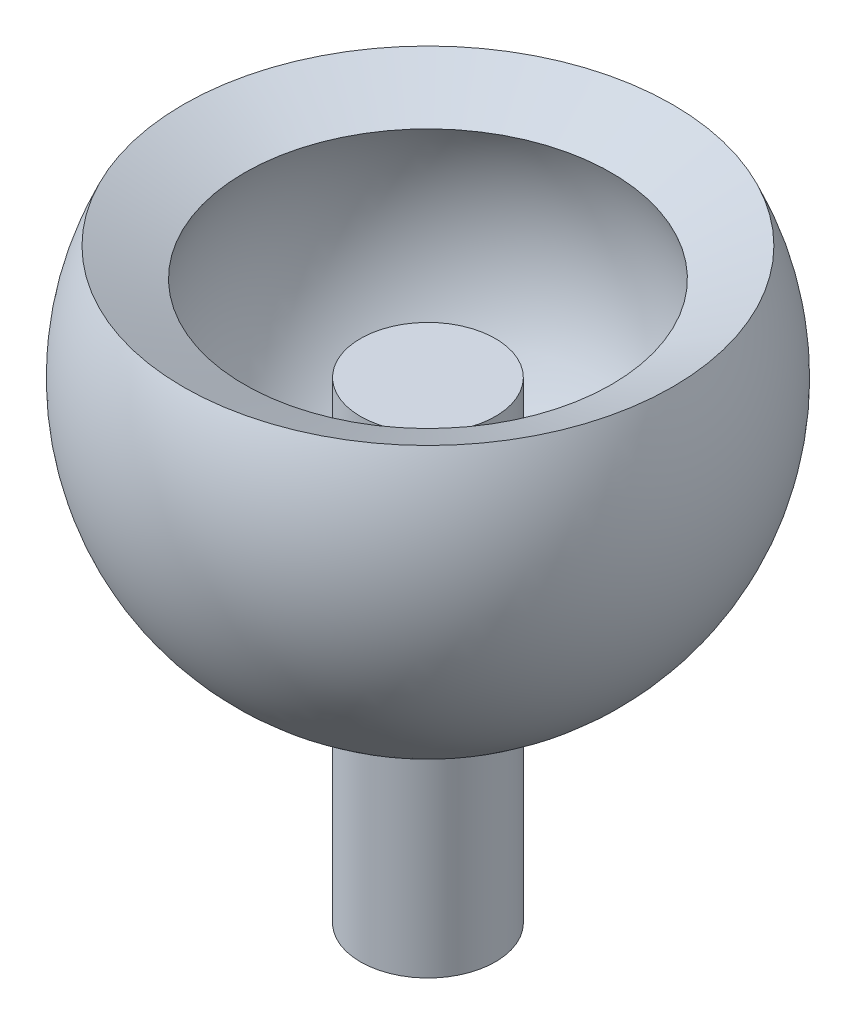
ISO-10303-21;
HEADER;
FILE_DESCRIPTION(('STEP AP214'),'2;1');
FILE_NAME('part.step','',(''),(''),'','','');
FILE_SCHEMA(('AUTOMOTIVE_DESIGN { 1 0 10303 214 1 1 1 1 }'));
ENDSEC;
DATA;
#1=APPLICATION_CONTEXT('core data for automotive mechanical design processes');
#2=APPLICATION_PROTOCOL_DEFINITION('international standard','automotive_design',2000,#1);
#3=PRODUCT_CONTEXT('',#1,'mechanical');
#4=PRODUCT('Part','Part','',(#3));
#5=PRODUCT_RELATED_PRODUCT_CATEGORY('part','',(#4));
#6=PRODUCT_DEFINITION_FORMATION('','',#4);
#7=PRODUCT_DEFINITION_CONTEXT('part definition',#1,'design');
#8=PRODUCT_DEFINITION('design','',#6,#7);
#9=PRODUCT_DEFINITION_SHAPE('','',#8);
#10=(LENGTH_UNIT() NAMED_UNIT(*) SI_UNIT(.MILLI.,.METRE.));
#11=(NAMED_UNIT(*) PLANE_ANGLE_UNIT() SI_UNIT($,.RADIAN.));
#12=(NAMED_UNIT(*) SI_UNIT($,.STERADIAN.) SOLID_ANGLE_UNIT());
#13=UNCERTAINTY_MEASURE_WITH_UNIT(LENGTH_MEASURE(1.E-05),#10,'distance_accuracy_value','');
#14=(GEOMETRIC_REPRESENTATION_CONTEXT(3) GLOBAL_UNCERTAINTY_ASSIGNED_CONTEXT((#13)) GLOBAL_UNIT_ASSIGNED_CONTEXT((#10,
#11,#12)) REPRESENTATION_CONTEXT('',''));
#15=CARTESIAN_POINT('',(0.,0.,0.));
#16=DIRECTION('',(0.,0.,1.));
#17=DIRECTION('',(1.,0.,0.));
#18=AXIS2_PLACEMENT_3D('',#15,#16,#17);
#19=CARTESIAN_POINT('',(0.,0.,0.));
#20=DIRECTION('',(0.,1.,0.));
#21=DIRECTION('',(1.,0.,0.));
#22=AXIS2_PLACEMENT_3D('',#19,#20,#21);
#23=SPHERICAL_SURFACE('',#22,6.);
#24=CARTESIAN_POINT('',(0.,-5.65685424949238,0.));
#25=DIRECTION('',(0.,1.,0.));
#26=DIRECTION('',(0.,0.,1.));
#27=AXIS2_PLACEMENT_3D('',#24,#25,#26);
#28=CIRCLE('',#27,2.);
#29=CARTESIAN_POINT('',(2.,-5.65685424949238,0.));
#30=VERTEX_POINT('',#29);
#31=EDGE_CURVE('E10',#30,#30,#28,.T.);
#32=CARTESIAN_POINT('',(0.,2.53570957044419,0.));
#33=DIRECTION('',(0.,1.,0.));
#34=DIRECTION('',(0.,0.,1.));
#35=AXIS2_PLACEMENT_3D('',#32,#33,#34);
#36=CIRCLE('',#35,5.4378467222199);
#37=CARTESIAN_POINT('',(5.4378467222199,2.53570957044419,0.));
#38=VERTEX_POINT('',#37);
#39=EDGE_CURVE('E40',#38,#38,#36,.T.);
#40=CARTESIAN_POINT('',(2.,-5.65685424949238,0.));
#41=CARTESIAN_POINT('',(2.0982471143099,-5.62212145240606,0.));
#42=CARTESIAN_POINT('',(2.19558736999006,-5.58482438796448,0.));
#43=CARTESIAN_POINT('',(2.38819441176864,-5.50521369029373,0.));
#44=CARTESIAN_POINT('',(2.48346119786707,-5.46290005706457,0.));
#45=CARTESIAN_POINT('',(2.67166154815997,-5.3733681877416,0.));
#46=CARTESIAN_POINT('',(2.76459511235444,-5.32614995164779,0.));
#47=CARTESIAN_POINT('',(2.94787710701112,-5.22693780232151,0.));
#48=CARTESIAN_POINT('',(3.03822553747333,-5.17494388908903,0.));
#49=CARTESIAN_POINT('',(3.21609196509179,-5.06632129530628,0.));
#50=CARTESIAN_POINT('',(3.30360996224804,-5.00969261475599,0.));
#51=CARTESIAN_POINT('',(3.47557801400766,-4.89195423728787,0.));
#52=CARTESIAN_POINT('',(3.56002806861104,-4.83084454037002,0.));
#53=CARTESIAN_POINT('',(3.72563102369543,-4.70430997283489,0.));
#54=CARTESIAN_POINT('',(3.80678392417644,-4.63888510221761,0.));
#55=CARTESIAN_POINT('',(3.96557231600782,-4.50389776054736,0.));
#56=CARTESIAN_POINT('',(4.04320780735819,-4.43433528949439,0.));
#57=CARTESIAN_POINT('',(4.19475067041844,-4.2912615450166,0.));
#58=CARTESIAN_POINT('',(4.26865804212834,-4.21775027159178,0.));
#59=CARTESIAN_POINT('',(4.41254407442537,-4.0669784392076,0.));
#60=CARTESIAN_POINT('',(4.48252273501251,-3.98971788024824,0.));
#61=CARTESIAN_POINT('',(4.61836141632597,-3.83165716918623,0.));
#62=CARTESIAN_POINT('',(4.68422143705228,-3.75085701708358,0.));
#63=CARTESIAN_POINT('',(4.81164408832437,-3.58593641901391,0.));
#64=CARTESIAN_POINT('',(4.87320671887015,-3.50181597304688,0.));
#65=CARTESIAN_POINT('',(4.99186750297431,-3.33048309809309,0.));
#66=CARTESIAN_POINT('',(5.04896565653269,-3.24327066910634,0.));
#67=CARTESIAN_POINT('',(5.15854251687107,-3.06599053089921,0.));
#68=CARTESIAN_POINT('',(5.21102122365107,-2.97592282167884,0.));
#69=CARTESIAN_POINT('',(5.31121675825658,-2.79317657528946,0.));
#70=CARTESIAN_POINT('',(5.3589335860821,-2.70049803812045,0.));
#71=CARTESIAN_POINT('',(5.44947585479283,-2.51278167415336,0.));
#72=CARTESIAN_POINT('',(5.49230129567805,-2.41774384735528,0.));
#73=CARTESIAN_POINT('',(5.57294455820929,-2.2255668457848,0.));
#74=CARTESIAN_POINT('',(5.61076237985533,-2.12842767101239,0.));
#75=CARTESIAN_POINT('',(5.68128776276182,-1.93231161840526,0.));
#76=CARTESIAN_POINT('',(5.71399532402228,-1.83333474057053,0.));
#77=CARTESIAN_POINT('',(5.77421141474136,-1.6338119144508,0.));
#78=CARTESIAN_POINT('',(5.80171994419998,-1.53326596616579,0.));
#79=CARTESIAN_POINT('',(5.85146331056385,-1.33087789036303,0.));
#80=CARTESIAN_POINT('',(5.87369814746911,-1.22903576284528,0.));
#81=CARTESIAN_POINT('',(5.91283378127348,-1.02433173774837,0.));
#82=CARTESIAN_POINT('',(5.92973457817259,-0.921469840169226,0.));
#83=CARTESIAN_POINT('',(5.95815626160818,-0.715005451870527,0.));
#84=CARTESIAN_POINT('',(5.96967714814465,-0.611402961150975,0.));
#85=CARTESIAN_POINT('',(5.98730774205821,-0.403738573542844,0.));
#86=CARTESIAN_POINT('',(5.99341744943529,-0.299676676654265,0.));
#87=CARTESIAN_POINT('',(6.0002091027828,-0.0913759105119523,0.));
#88=CARTESIAN_POINT('',(6.00089104875323,0.0128629587417805,0.));
#89=CARTESIAN_POINT('',(5.99682532813532,0.22123475534404,0.));
#90=CARTESIAN_POINT('',(5.99207766154699,0.325367682692567,0.));
#91=CARTESIAN_POINT('',(5.97716560249614,0.533244969298057,0.));
#92=CARTESIAN_POINT('',(5.96700121003362,0.636989328555019,0.));
#93=CARTESIAN_POINT('',(5.94128328237066,0.843807905357749,0.));
#94=CARTESIAN_POINT('',(5.92572974717021,0.946882122903517,0.));
#95=CARTESIAN_POINT('',(5.8892757626762,1.15208066911995,0.));
#96=CARTESIAN_POINT('',(5.86837531338265,1.25420499779062,0.));
#97=CARTESIAN_POINT('',(5.82128417097193,1.45722656871425,0.));
#98=CARTESIAN_POINT('',(5.79509347785476,1.55812381096722,0.));
#99=CARTESIAN_POINT('',(5.73749313904792,1.75841744818171,0.));
#100=CARTESIAN_POINT('',(5.70608349335824,1.85781384314323,0.));
#101=CARTESIAN_POINT('',(5.63812972475758,2.05483570184882,0.));
#102=CARTESIAN_POINT('',(5.60158560184659,2.15246116559288,0.));
#103=CARTESIAN_POINT('',(5.52346494937628,2.34567736414758,0.));
#104=CARTESIAN_POINT('',(5.48188841981694,2.44126809895823,0.));
#105=CARTESIAN_POINT('',(5.4378467222199,2.53570957044419,0.));
#106=B_SPLINE_CURVE_WITH_KNOTS('',3,(#40,#41,#42,#43,#44,#45,#46,#47,#48,#49,#50,#51,#52,#53,
#54,#55,#56,#57,#58,#59,#60,#61,#62,#63,#64,#65,#66,#67,#68,#69,#70,#71,#72,#73,#74,#75,#76,#77,
#78,#79,#80,#81,#82,#83,#84,#85,#86,#87,#88,#89,#90,#91,#92,#93,#94,#95,#96,#97,#98,#99,#100,
#101,#102,#103,#104,#105),.UNSPECIFIED.,.F.,.F.,(4,2,2,2,2,2,2,2,2,2,2,2,2,2,2,2,2,2,2,2,2,2,2,
2,2,2,2,2,2,2,2,2,4),(0.,0.312581839612184,0.625163679224368,0.937745518836551,1.25032735844873,
1.56290919806092,1.8754910376731,2.18807287728529,2.50065471689747,2.81323655650965,
3.12581839612184,3.43840023573402,3.7509820753462,4.06356391495839,4.37614575457057,
4.68872759418276,5.00130943379494,5.31389127340712,5.62647311301931,5.93905495263149,
6.25163679224367,6.56421863185586,6.87680047146804,7.18938231108023,7.50196415069241,
7.81454599030459,8.12712782991678,8.43970966952896,8.75229150914115,9.06487334875333,
9.37745518836551,9.6900370279777,10.0026188675899),.UNSPECIFIED.);
#107=EDGE_CURVE('BSEAM29',#30,#38,#106,.T.);
#108=ORIENTED_EDGE('',*,*,#31,.F.);
#109=ORIENTED_EDGE('',*,*,#39,.T.);
#110=ORIENTED_EDGE('',*,*,#107,.T.);
#111=ORIENTED_EDGE('',*,*,#107,.F.);
#112=EDGE_LOOP('',(#108,#110,#109,#111));
#113=FACE_BOUND('',#112,.T.);
#114=ADVANCED_FACE('F29',(#113),#23,.F.);
#115=CARTESIAN_POINT('',(0.,2.53570957044419,0.));
#116=DIRECTION('',(0.,1.,0.));
#117=DIRECTION('',(0.,0.,1.));
#118=AXIS2_PLACEMENT_3D('',#115,#116,#117);
#119=CONICAL_SURFACE('',#118,5.4378467222199,1.13446401379632);
#120=CARTESIAN_POINT('',(0.,3.38094609392559,0.));
#121=DIRECTION('',(0.,1.,0.));
#122=DIRECTION('',(0.,0.,1.));
#123=AXIS2_PLACEMENT_3D('',#120,#121,#122);
#124=CIRCLE('',#123,7.25046229629321);
#125=CARTESIAN_POINT('',(-7.2504622962932,3.38094609392559,0.));
#126=VERTEX_POINT('',#125);
#127=EDGE_CURVE('E45',#126,#126,#124,.T.);
#128=ORIENTED_EDGE('',*,*,#127,.T.);
#129=EDGE_LOOP('',(#128));
#130=FACE_BOUND('',#129,.T.);
#131=ORIENTED_EDGE('',*,*,#39,.F.);
#132=EDGE_LOOP('',(#131));
#133=FACE_BOUND('',#132,.T.);
#134=ADVANCED_FACE('F52',(#130,#133),#119,.F.);
#135=CARTESIAN_POINT('',(0.,0.,0.));
#136=DIRECTION('',(0.,1.,0.));
#137=DIRECTION('',(-1.,0.,0.));
#138=AXIS2_PLACEMENT_3D('',#135,#136,#137);
#139=SPHERICAL_SURFACE('',#138,8.);
#140=CARTESIAN_POINT('',(0.,-7.74596669241483,0.));
#141=DIRECTION('',(0.,1.,0.));
#142=DIRECTION('',(0.,0.,1.));
#143=AXIS2_PLACEMENT_3D('',#140,#141,#142);
#144=CIRCLE('',#143,2.);
#145=CARTESIAN_POINT('',(-2.,-7.74596669241483,0.));
#146=VERTEX_POINT('',#145);
#147=EDGE_CURVE('E32',#146,#146,#144,.F.);
#148=CARTESIAN_POINT('',(-2.,-7.74596669241483,0.));
#149=CARTESIAN_POINT('',(-2.14156274777475,-7.70941980978731,0.));
#150=CARTESIAN_POINT('',(-2.28212099416809,-7.66898415263342,0.));
#151=CARTESIAN_POINT('',(-2.56081182856566,-7.58047490906736,0.));
#152=CARTESIAN_POINT('',(-2.69894441656987,-7.53240132265519,0.));
#153=CARTESIAN_POINT('',(-2.97236727856286,-7.42875584036702,0.));
#154=CARTESIAN_POINT('',(-3.10765755255163,-7.37318394449102,0.));
#155=CARTESIAN_POINT('',(-3.37498962582622,-7.25471014730052,0.));
#156=CARTESIAN_POINT('',(-3.50703142511205,-7.19180824598602,0.));
#157=CARTESIAN_POINT('',(-3.76746962722059,-7.05886312204473,0.));
#158=CARTESIAN_POINT('',(-3.8958660300433,-6.98881989941795,0.));
#159=CARTESIAN_POINT('',(-4.14862761282328,-6.8418027196068,0.));
#160=CARTESIAN_POINT('',(-4.27299279278054,-6.76482876242245,0.));
#161=CARTESIAN_POINT('',(-4.51731818045596,-6.60418141012952,0.));
#162=CARTESIAN_POINT('',(-4.63727838817412,-6.52050801502096,0.));
#163=CARTESIAN_POINT('',(-4.87243332986022,-6.34671324832415,0.));
#164=CARTESIAN_POINT('',(-4.98762806382815,-6.25659187673591,0.));
#165=CARTESIAN_POINT('',(-5.21290587497567,-6.07017198744642,0.));
#166=CARTESIAN_POINT('',(-5.32298895215526,-5.97387346974517,0.));
#167=CARTESIAN_POINT('',(-5.53771262892867,-5.77538868439204,0.));
#168=CARTESIAN_POINT('',(-5.6423532285225,-5.67320241674016,0.));
#169=CARTESIAN_POINT('',(-5.84587748483169,-5.4632492208662,0.));
#170=CARTESIAN_POINT('',(-5.94476114154705,-5.35548229264413,0.));
#171=CARTESIAN_POINT('',(-6.13647434758592,-5.13469163613865,0.));
#172=CARTESIAN_POINT('',(-6.22930389690942,-5.02166790785525,0.));
#173=CARTESIAN_POINT('',(-6.40862991740157,-4.79070330939366,0.));
#174=CARTESIAN_POINT('',(-6.49512638857022,-4.67276243921547,0.));
#175=CARTESIAN_POINT('',(-6.66152631411884,-4.43231799210554,0.));
#176=CARTESIAN_POINT('',(-6.7414297684988,-4.3098144151738,0.));
#177=CARTESIAN_POINT('',(-6.89440353512652,-4.06061270151162,0.));
#178=CARTESIAN_POINT('',(-6.96747384737429,-3.93391456478119,0.));
#179=CARTESIAN_POINT('',(-7.10656173930884,-3.67670448394126,0.));
#180=CARTESIAN_POINT('',(-7.17257931899562,-3.54619253983176,0.));
#181=CARTESIAN_POINT('',(-7.29736335020553,-3.28174705788232,0.));
#182=CARTESIAN_POINT('',(-7.35612980172865,-3.14781352004238,0.));
#183=CARTESIAN_POINT('',(-7.46623497205199,-2.87692734683203,0.));
#184=CARTESIAN_POINT('',(-7.51757369085222,-2.73997471146162,0.));
#185=CARTESIAN_POINT('',(-7.61266911294455,-2.4634619123627,0.));
#186=CARTESIAN_POINT('',(-7.65642581623665,-2.32390174863419,0.));
#187=CARTESIAN_POINT('',(-7.73622570995222,-2.04259329811845,0.));
#188=CARTESIAN_POINT('',(-7.77226890037569,-1.90084501133122,0.));
#189=CARTESIAN_POINT('',(-7.83653345158927,-1.61558629573186,0.));
#190=CARTESIAN_POINT('',(-7.86475481237939,-1.47207586691974,0.));
#191=CARTESIAN_POINT('',(-7.91329089368474,-1.18372414387765,0.));
#192=CARTESIAN_POINT('',(-7.93360561419996,-1.03888284964769,0.));
#193=CARTESIAN_POINT('',(-7.96626736525545,-0.748304671902203,0.));
#194=CARTESIAN_POINT('',(-7.97861439579571,-0.60256778838668,0.));
#195=CARTESIAN_POINT('',(-7.9953036618106,-0.310636399557634,0.));
#196=CARTESIAN_POINT('',(-7.99964589728524,-0.164441894244111,0.));
#197=CARTESIAN_POINT('',(-8.00031252344256,0.127965395213059,0.));
#198=CARTESIAN_POINT('',(-7.99663691412525,0.274178179356705,0.));
#199=CARTESIAN_POINT('',(-7.98127889836413,0.566182629464012,0.));
#200=CARTESIAN_POINT('',(-7.96959649192031,0.711974295427672,0.));
#201=CARTESIAN_POINT('',(-7.93825998327417,1.00269837438802,0.));
#202=CARTESIAN_POINT('',(-7.91860588107185,1.1476307873847,0.));
#203=CARTESIAN_POINT('',(-7.8713850696377,1.43620082023039,0.));
#204=CARTESIAN_POINT('',(-7.84381836040587,1.57983844007939,0.));
#205=CARTESIAN_POINT('',(-7.78085508733904,1.86538719133214,0.));
#206=CARTESIAN_POINT('',(-7.74545852350404,2.00729832273589,0.));
#207=CARTESIAN_POINT('',(-7.66694225388515,2.288967762731,0.));
#208=CARTESIAN_POINT('',(-7.62382254810126,2.42872607132237,0.));
#209=CARTESIAN_POINT('',(-7.52998831199445,2.70566935720133,0.));
#210=CARTESIAN_POINT('',(-7.47927378167153,2.84285433448892,0.));
#211=CARTESIAN_POINT('',(-7.37040702693664,3.11424058522271,0.));
#212=CARTESIAN_POINT('',(-7.31225480252468,3.2484418586689,0.));
#213=CARTESIAN_POINT('',(-7.25046229629321,3.38094609392559,0.));
#214=B_SPLINE_CURVE_WITH_KNOTS('',3,(#148,#149,#150,#151,#152,#153,#154,#155,#156,#157,#158,
#159,#160,#161,#162,#163,#164,#165,#166,#167,#168,#169,#170,#171,#172,#173,#174,#175,#176,#177,
#178,#179,#180,#181,#182,#183,#184,#185,#186,#187,#188,#189,#190,#191,#192,#193,#194,#195,#196,
#197,#198,#199,#200,#201,#202,#203,#204,#205,#206,#207,#208,#209,#210,#211,#212,#213),
.UNSPECIFIED.,.F.,.F.,(4,2,2,2,2,2,2,2,2,2,2,2,2,2,2,2,2,2,2,2,2,2,2,2,2,2,2,2,2,2,2,2,4),(0.,
0.438557163041116,0.877114326082233,1.31567148912335,1.75422865216447,2.19278581520558,
2.6313429782467,3.06990014128782,3.50845730432894,3.94701446737005,4.38557163041117,
4.82412879345229,5.2626859564934,5.70124311953452,6.13980028257564,6.57835744561675,
7.01691460865787,7.45547177169899,7.8940289347401,8.33258609778122,8.77114326082234,
9.20970042386345,9.64825758690457,10.0868147499457,10.5253719129868,10.9639290760279,
11.402486239069,11.8410434021102,12.2796005651513,12.7181577281924,13.1567148912335,
13.5952720542746,14.0338292173157),.UNSPECIFIED.);
#215=EDGE_CURVE('BSEAM54',#146,#126,#214,.T.);
#216=ORIENTED_EDGE('',*,*,#147,.F.);
#217=ORIENTED_EDGE('',*,*,#127,.F.);
#218=ORIENTED_EDGE('',*,*,#215,.T.);
#219=ORIENTED_EDGE('',*,*,#215,.F.);
#220=EDGE_LOOP('',(#216,#218,#217,#219));
#221=FACE_BOUND('',#220,.T.);
#222=ADVANCED_FACE('F54',(#221),#139,.T.);
#223=CARTESIAN_POINT('',(0.,-14.,0.));
#224=DIRECTION('',(0.,1.,0.));
#225=DIRECTION('',(0.,0.,1.));
#226=AXIS2_PLACEMENT_3D('',#223,#224,#225);
#227=PLANE('',#226);
#228=CARTESIAN_POINT('',(0.,-14.,0.));
#229=DIRECTION('',(0.,1.,0.));
#230=DIRECTION('',(0.,0.,1.));
#231=AXIS2_PLACEMENT_3D('',#228,#229,#230);
#232=CIRCLE('',#231,2.);
#233=CARTESIAN_POINT('',(0.,-14.,2.));
#234=VERTEX_POINT('',#233);
#235=EDGE_CURVE('E47',#234,#234,#232,.T.);
#236=ORIENTED_EDGE('',*,*,#235,.F.);
#237=EDGE_LOOP('',(#236));
#238=FACE_BOUND('',#237,.T.);
#239=ADVANCED_FACE('F60',(#238),#227,.F.);
#240=CARTESIAN_POINT('',(0.,-14.,0.));
#241=DIRECTION('',(0.,1.,0.));
#242=DIRECTION('',(0.,0.,1.));
#243=AXIS2_PLACEMENT_3D('',#240,#241,#242);
#244=CYLINDRICAL_SURFACE('',#243,2.);
#245=ORIENTED_EDGE('',*,*,#147,.T.);
#246=EDGE_LOOP('',(#245));
#247=FACE_BOUND('',#246,.T.);
#248=ORIENTED_EDGE('',*,*,#235,.T.);
#249=EDGE_LOOP('',(#248));
#250=FACE_BOUND('',#249,.T.);
#251=ADVANCED_FACE('F65',(#247,#250),#244,.T.);
#252=ORIENTED_EDGE('',*,*,#31,.T.);
#253=EDGE_LOOP('',(#252));
#254=FACE_BOUND('',#253,.T.);
#255=CARTESIAN_POINT('',(0.,0.,0.));
#256=DIRECTION('',(0.,1.,0.));
#257=DIRECTION('',(0.,0.,1.));
#258=AXIS2_PLACEMENT_3D('',#255,#256,#257);
#259=CIRCLE('',#258,2.);
#260=CARTESIAN_POINT('',(0.,0.,2.));
#261=VERTEX_POINT('',#260);
#262=EDGE_CURVE('E43',#261,#261,#259,.T.);
#263=ORIENTED_EDGE('',*,*,#262,.F.);
#264=EDGE_LOOP('',(#263));
#265=FACE_BOUND('',#264,.T.);
#266=ADVANCED_FACE('F68',(#254,#265),#244,.T.);
#267=CARTESIAN_POINT('',(0.,0.,0.));
#268=DIRECTION('',(0.,1.,0.));
#269=DIRECTION('',(0.,0.,1.));
#270=AXIS2_PLACEMENT_3D('',#267,#268,#269);
#271=PLANE('',#270);
#272=ORIENTED_EDGE('',*,*,#262,.T.);
#273=EDGE_LOOP('',(#272));
#274=FACE_BOUND('',#273,.T.);
#275=ADVANCED_FACE('F70',(#274),#271,.T.);
#276=CLOSED_SHELL('',(#114,#134,#222,#239,#251,#266,#275));
#277=MANIFOLD_SOLID_BREP('B2',#276);
#278=ADVANCED_BREP_SHAPE_REPRESENTATION('',(#18,#277),#14);
#279=SHAPE_DEFINITION_REPRESENTATION(#9,#278);
ENDSEC;
END-ISO-10303-21;
